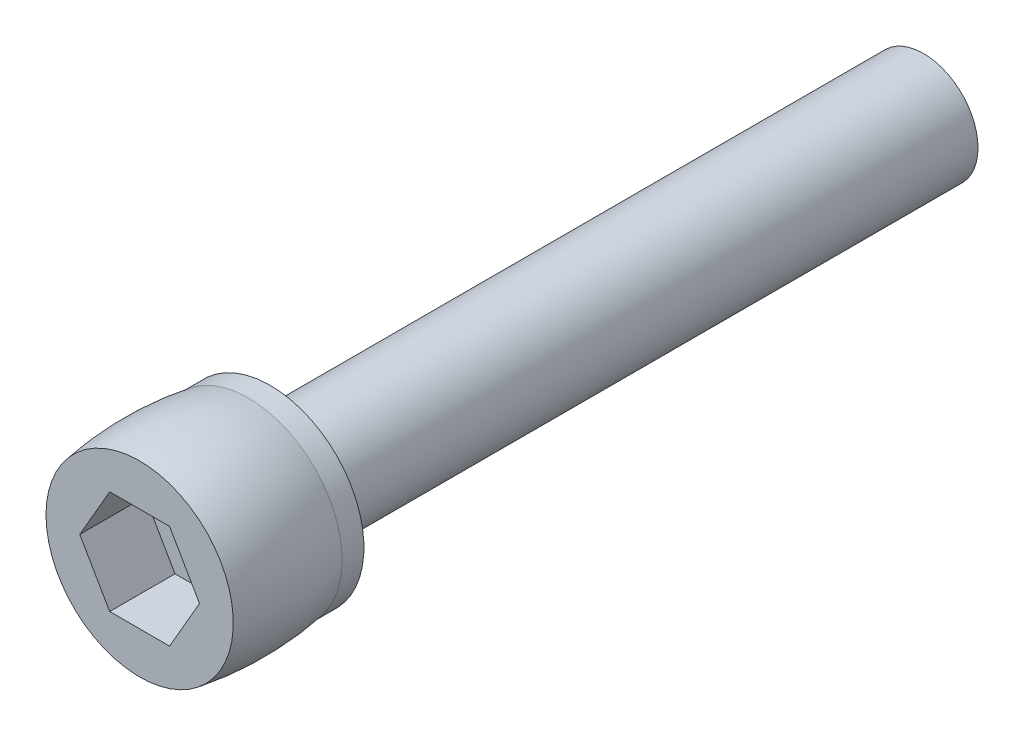
ISO-10303-21;
HEADER;
FILE_DESCRIPTION(('STEP AP214'),'2;1');
FILE_NAME('part.step','',(''),(''),'','','');
FILE_SCHEMA(('AUTOMOTIVE_DESIGN { 1 0 10303 214 1 1 1 1 }'));
ENDSEC;
DATA;
#1=APPLICATION_CONTEXT('core data for automotive mechanical design processes');
#2=APPLICATION_PROTOCOL_DEFINITION('international standard','automotive_design',2000,#1);
#3=PRODUCT_CONTEXT('',#1,'mechanical');
#4=PRODUCT('Part','Part','',(#3));
#5=PRODUCT_RELATED_PRODUCT_CATEGORY('part','',(#4));
#6=PRODUCT_DEFINITION_FORMATION('','',#4);
#7=PRODUCT_DEFINITION_CONTEXT('part definition',#1,'design');
#8=PRODUCT_DEFINITION('design','',#6,#7);
#9=PRODUCT_DEFINITION_SHAPE('','',#8);
#10=(LENGTH_UNIT() NAMED_UNIT(*) SI_UNIT(.MILLI.,.METRE.));
#11=(NAMED_UNIT(*) PLANE_ANGLE_UNIT() SI_UNIT($,.RADIAN.));
#12=(NAMED_UNIT(*) SI_UNIT($,.STERADIAN.) SOLID_ANGLE_UNIT());
#13=UNCERTAINTY_MEASURE_WITH_UNIT(LENGTH_MEASURE(1.E-05),#10,'distance_accuracy_value','');
#14=(GEOMETRIC_REPRESENTATION_CONTEXT(3) GLOBAL_UNCERTAINTY_ASSIGNED_CONTEXT((#13)) GLOBAL_UNIT_ASSIGNED_CONTEXT((#10,
#11,#12)) REPRESENTATION_CONTEXT('',''));
#15=CARTESIAN_POINT('',(0.,0.,0.));
#16=DIRECTION('',(0.,0.,1.));
#17=DIRECTION('',(1.,0.,0.));
#18=AXIS2_PLACEMENT_3D('',#15,#16,#17);
#19=CARTESIAN_POINT('',(0.,0.,0.));
#20=DIRECTION('',(0.,0.,1.));
#21=DIRECTION('',(1.,0.,0.));
#22=AXIS2_PLACEMENT_3D('',#19,#20,#21);
#23=PLANE('',#22);
#24=CARTESIAN_POINT('',(0.,0.,0.));
#25=DIRECTION('',(0.,0.,1.));
#26=DIRECTION('',(1.,0.,0.));
#27=AXIS2_PLACEMENT_3D('',#24,#25,#26);
#28=CIRCLE('',#27,1.25);
#29=CARTESIAN_POINT('',(1.25,0.,0.));
#30=VERTEX_POINT('',#29);
#31=EDGE_CURVE('E45',#30,#30,#28,.T.);
#32=ORIENTED_EDGE('',*,*,#31,.T.);
#33=EDGE_LOOP('',(#32));
#34=FACE_BOUND('',#33,.T.);
#35=CARTESIAN_POINT('',(0.,0.,0.));
#36=DIRECTION('',(0.,0.,-1.));
#37=DIRECTION('',(-1.,0.,0.));
#38=AXIS2_PLACEMENT_3D('',#35,#36,#37);
#39=CIRCLE('',#38,2.15);
#40=CARTESIAN_POINT('',(-2.15,0.,0.));
#41=VERTEX_POINT('',#40);
#42=EDGE_CURVE('E169',#41,#41,#39,.T.);
#43=ORIENTED_EDGE('',*,*,#42,.T.);
#44=EDGE_LOOP('',(#43));
#45=FACE_BOUND('',#44,.T.);
#46=ADVANCED_FACE('F41',(#34,#45),#23,.F.);
#47=CARTESIAN_POINT('',(0.,0.,-15.));
#48=DIRECTION('',(0.,0.,1.));
#49=DIRECTION('',(1.,0.,0.));
#50=AXIS2_PLACEMENT_3D('',#47,#48,#49);
#51=CYLINDRICAL_SURFACE('',#50,1.25);
#52=CARTESIAN_POINT('',(0.,0.,-15.));
#53=DIRECTION('',(0.,0.,1.));
#54=DIRECTION('',(1.,0.,0.));
#55=AXIS2_PLACEMENT_3D('',#52,#53,#54);
#56=CIRCLE('',#55,1.25);
#57=CARTESIAN_POINT('',(1.25,0.,-15.));
#58=VERTEX_POINT('',#57);
#59=EDGE_CURVE('E11',#58,#58,#56,.T.);
#60=ORIENTED_EDGE('',*,*,#59,.T.);
#61=EDGE_LOOP('',(#60));
#62=FACE_BOUND('',#61,.T.);
#63=ORIENTED_EDGE('',*,*,#31,.F.);
#64=EDGE_LOOP('',(#63));
#65=FACE_BOUND('',#64,.T.);
#66=ADVANCED_FACE('F43',(#62,#65),#51,.T.);
#67=CARTESIAN_POINT('',(0.,0.,-15.));
#68=DIRECTION('',(0.,0.,1.));
#69=DIRECTION('',(1.,0.,0.));
#70=AXIS2_PLACEMENT_3D('',#67,#68,#69);
#71=PLANE('',#70);
#72=ORIENTED_EDGE('',*,*,#59,.F.);
#73=EDGE_LOOP('',(#72));
#74=FACE_BOUND('',#73,.T.);
#75=ADVANCED_FACE('F185',(#74),#71,.F.);
#76=CARTESIAN_POINT('',(0.,0.,1.75));
#77=DIRECTION('',(0.,0.,-1.));
#78=DIRECTION('',(-1.,0.,0.));
#79=AXIS2_PLACEMENT_3D('',#76,#77,#78);
#80=DEGENERATE_TOROIDAL_SURFACE('',#79,5.61250000000011,7.86250000000011,.F.);
#81=CARTESIAN_POINT('',(0.,0.,3.));
#82=DIRECTION('',(0.,0.,-1.));
#83=DIRECTION('',(-1.,0.,0.));
#84=AXIS2_PLACEMENT_3D('',#81,#82,#83);
#85=CIRCLE('',#84,2.15);
#86=CARTESIAN_POINT('',(-2.15,0.,3.));
#87=VERTEX_POINT('',#86);
#88=EDGE_CURVE('E156',#87,#87,#85,.T.);
#89=ORIENTED_EDGE('',*,*,#88,.T.);
#90=EDGE_LOOP('',(#89));
#91=FACE_BOUND('',#90,.T.);
#92=CARTESIAN_POINT('',(0.,0.,0.5));
#93=DIRECTION('',(0.,0.,-1.));
#94=DIRECTION('',(-1.,0.,0.));
#95=AXIS2_PLACEMENT_3D('',#92,#93,#94);
#96=CIRCLE('',#95,2.15);
#97=CARTESIAN_POINT('',(-2.15,0.,0.5));
#98=VERTEX_POINT('',#97);
#99=EDGE_CURVE('E173',#98,#98,#96,.T.);
#100=ORIENTED_EDGE('',*,*,#99,.F.);
#101=EDGE_LOOP('',(#100));
#102=FACE_BOUND('',#101,.T.);
#103=ADVANCED_FACE('F191',(#91,#102),#80,.F.);
#104=CARTESIAN_POINT('',(0.,0.,3.));
#105=DIRECTION('',(0.,0.,-1.));
#106=DIRECTION('',(-1.,0.,0.));
#107=AXIS2_PLACEMENT_3D('',#104,#105,#106);
#108=CYLINDRICAL_SURFACE('',#107,2.15);
#109=ORIENTED_EDGE('',*,*,#42,.F.);
#110=EDGE_LOOP('',(#109));
#111=FACE_BOUND('',#110,.T.);
#112=ORIENTED_EDGE('',*,*,#99,.T.);
#113=EDGE_LOOP('',(#112));
#114=FACE_BOUND('',#113,.T.);
#115=ADVANCED_FACE('F202',(#111,#114),#108,.T.);
#116=CARTESIAN_POINT('',(0.,0.,3.));
#117=DIRECTION('',(0.,0.,1.));
#118=DIRECTION('',(1.,0.,0.));
#119=AXIS2_PLACEMENT_3D('',#116,#117,#118);
#120=PLANE('',#119);
#121=DIRECTION('',(0.5,0.866025403784439,0.));
#122=VECTOR('',#121,1.);
#123=CARTESIAN_POINT('',(0.687407664253899,-1.190625,3.));
#124=LINE('',#123,#122);
#125=CARTESIAN_POINT('',(0.687407664253899,-1.190625,3.));
#126=VERTEX_POINT('',#125);
#127=CARTESIAN_POINT('',(1.3748153285078,0.,3.));
#128=VERTEX_POINT('',#127);
#129=EDGE_CURVE('E57',#126,#128,#124,.T.);
#130=ORIENTED_EDGE('',*,*,#129,.F.);
#131=DIRECTION('',(1.,0.,0.));
#132=VECTOR('',#131,1.);
#133=CARTESIAN_POINT('',(-0.687407664253898,-1.190625,3.));
#134=LINE('',#133,#132);
#135=CARTESIAN_POINT('',(-0.687407664253898,-1.190625,3.));
#136=VERTEX_POINT('',#135);
#137=EDGE_CURVE('E150',#136,#126,#134,.T.);
#138=ORIENTED_EDGE('',*,*,#137,.F.);
#139=DIRECTION('',(0.5,-0.866025403784439,0.));
#140=VECTOR('',#139,1.);
#141=CARTESIAN_POINT('',(-1.3748153285078,0.,3.));
#142=LINE('',#141,#140);
#143=CARTESIAN_POINT('',(-1.3748153285078,0.,3.));
#144=VERTEX_POINT('',#143);
#145=EDGE_CURVE('E147',#144,#136,#142,.T.);
#146=ORIENTED_EDGE('',*,*,#145,.F.);
#147=DIRECTION('',(-0.5,-0.866025403784439,0.));
#148=VECTOR('',#147,1.);
#149=CARTESIAN_POINT('',(-0.687407664253899,1.190625,3.));
#150=LINE('',#149,#148);
#151=CARTESIAN_POINT('',(-0.687407664253899,1.190625,3.));
#152=VERTEX_POINT('',#151);
#153=EDGE_CURVE('E105',#152,#144,#150,.T.);
#154=ORIENTED_EDGE('',*,*,#153,.F.);
#155=DIRECTION('',(-1.,0.,0.));
#156=VECTOR('',#155,1.);
#157=CARTESIAN_POINT('',(0.687407664253899,1.190625,3.));
#158=LINE('',#157,#156);
#159=CARTESIAN_POINT('',(0.687407664253899,1.190625,3.));
#160=VERTEX_POINT('',#159);
#161=EDGE_CURVE('E141',#160,#152,#158,.T.);
#162=ORIENTED_EDGE('',*,*,#161,.F.);
#163=DIRECTION('',(-0.5,0.866025403784439,0.));
#164=VECTOR('',#163,1.);
#165=CARTESIAN_POINT('',(1.3748153285078,0.,3.));
#166=LINE('',#165,#164);
#167=EDGE_CURVE('E137',#128,#160,#166,.T.);
#168=ORIENTED_EDGE('',*,*,#167,.F.);
#169=EDGE_LOOP('',(#130,#138,#146,#154,#162,#168));
#170=FACE_BOUND('',#169,.T.);
#171=ORIENTED_EDGE('',*,*,#88,.F.);
#172=EDGE_LOOP('',(#171));
#173=FACE_BOUND('',#172,.T.);
#174=ADVANCED_FACE('F198',(#170,#173),#120,.T.);
#175=CARTESIAN_POINT('',(0.687407664253899,-1.190625,1.5));
#176=DIRECTION('',(0.866025403784439,-0.5,0.));
#177=DIRECTION('',(0.5,0.866025403784439,0.));
#178=AXIS2_PLACEMENT_3D('',#175,#176,#177);
#179=PLANE('',#178);
#180=ORIENTED_EDGE('',*,*,#129,.T.);
#181=DIRECTION('',(0.,0.,1.));
#182=VECTOR('',#181,1.);
#183=CARTESIAN_POINT('',(1.3748153285078,0.,1.5));
#184=LINE('',#183,#182);
#185=CARTESIAN_POINT('',(1.3748153285078,0.,1.5));
#186=VERTEX_POINT('',#185);
#187=EDGE_CURVE('E87',#186,#128,#184,.T.);
#188=ORIENTED_EDGE('',*,*,#187,.F.);
#189=DIRECTION('',(0.5,0.866025403784439,0.));
#190=VECTOR('',#189,1.);
#191=CARTESIAN_POINT('',(0.687407664253899,-1.190625,1.5));
#192=LINE('',#191,#190);
#193=CARTESIAN_POINT('',(0.687407664253899,-1.190625,1.5));
#194=VERTEX_POINT('',#193);
#195=EDGE_CURVE('E153',#194,#186,#192,.T.);
#196=ORIENTED_EDGE('',*,*,#195,.F.);
#197=DIRECTION('',(0.,0.,1.));
#198=VECTOR('',#197,1.);
#199=CARTESIAN_POINT('',(0.687407664253899,-1.190625,1.5));
#200=LINE('',#199,#198);
#201=EDGE_CURVE('E65',#194,#126,#200,.T.);
#202=ORIENTED_EDGE('',*,*,#201,.T.);
#203=EDGE_LOOP('',(#180,#188,#196,#202));
#204=FACE_BOUND('',#203,.T.);
#205=ADVANCED_FACE('F201',(#204),#179,.F.);
#206=CARTESIAN_POINT('',(-0.687407664253898,-1.190625,1.5));
#207=DIRECTION('',(0.,-1.,0.));
#208=DIRECTION('',(0.,0.,-1.));
#209=AXIS2_PLACEMENT_3D('',#206,#207,#208);
#210=PLANE('',#209);
#211=ORIENTED_EDGE('',*,*,#137,.T.);
#212=ORIENTED_EDGE('',*,*,#201,.F.);
#213=DIRECTION('',(1.,0.,0.));
#214=VECTOR('',#213,1.);
#215=CARTESIAN_POINT('',(-0.687407664253898,-1.190625,1.5));
#216=LINE('',#215,#214);
#217=CARTESIAN_POINT('',(-0.687407664253898,-1.190625,1.5));
#218=VERTEX_POINT('',#217);
#219=EDGE_CURVE('E119',#218,#194,#216,.T.);
#220=ORIENTED_EDGE('',*,*,#219,.F.);
#221=DIRECTION('',(0.,0.,1.));
#222=VECTOR('',#221,1.);
#223=CARTESIAN_POINT('',(-0.687407664253898,-1.190625,1.5));
#224=LINE('',#223,#222);
#225=EDGE_CURVE('E110',#218,#136,#224,.T.);
#226=ORIENTED_EDGE('',*,*,#225,.T.);
#227=EDGE_LOOP('',(#211,#212,#220,#226));
#228=FACE_BOUND('',#227,.T.);
#229=ADVANCED_FACE('F212',(#228),#210,.F.);
#230=CARTESIAN_POINT('',(-1.3748153285078,0.,1.5));
#231=DIRECTION('',(-0.866025403784439,-0.5,0.));
#232=DIRECTION('',(0.5,-0.866025403784439,0.));
#233=AXIS2_PLACEMENT_3D('',#230,#231,#232);
#234=PLANE('',#233);
#235=ORIENTED_EDGE('',*,*,#145,.T.);
#236=ORIENTED_EDGE('',*,*,#225,.F.);
#237=DIRECTION('',(0.5,-0.866025403784439,0.));
#238=VECTOR('',#237,1.);
#239=CARTESIAN_POINT('',(-1.3748153285078,0.,1.5));
#240=LINE('',#239,#238);
#241=CARTESIAN_POINT('',(-1.3748153285078,0.,1.5));
#242=VERTEX_POINT('',#241);
#243=EDGE_CURVE('E114',#242,#218,#240,.T.);
#244=ORIENTED_EDGE('',*,*,#243,.F.);
#245=DIRECTION('',(0.,0.,1.));
#246=VECTOR('',#245,1.);
#247=CARTESIAN_POINT('',(-1.3748153285078,0.,1.5));
#248=LINE('',#247,#246);
#249=EDGE_CURVE('E98',#242,#144,#248,.T.);
#250=ORIENTED_EDGE('',*,*,#249,.T.);
#251=EDGE_LOOP('',(#235,#236,#244,#250));
#252=FACE_BOUND('',#251,.T.);
#253=ADVANCED_FACE('F115',(#252),#234,.F.);
#254=CARTESIAN_POINT('',(-0.687407664253899,1.190625,1.5));
#255=DIRECTION('',(-0.866025403784439,0.5,0.));
#256=DIRECTION('',(-0.5,-0.866025403784439,0.));
#257=AXIS2_PLACEMENT_3D('',#254,#255,#256);
#258=PLANE('',#257);
#259=ORIENTED_EDGE('',*,*,#153,.T.);
#260=ORIENTED_EDGE('',*,*,#249,.F.);
#261=DIRECTION('',(-0.5,-0.866025403784439,0.));
#262=VECTOR('',#261,1.);
#263=CARTESIAN_POINT('',(-0.687407664253899,1.190625,1.5));
#264=LINE('',#263,#262);
#265=CARTESIAN_POINT('',(-0.687407664253899,1.190625,1.5));
#266=VERTEX_POINT('',#265);
#267=EDGE_CURVE('E102',#266,#242,#264,.T.);
#268=ORIENTED_EDGE('',*,*,#267,.F.);
#269=DIRECTION('',(0.,0.,1.));
#270=VECTOR('',#269,1.);
#271=CARTESIAN_POINT('',(-0.687407664253899,1.190625,1.5));
#272=LINE('',#271,#270);
#273=EDGE_CURVE('E111',#266,#152,#272,.T.);
#274=ORIENTED_EDGE('',*,*,#273,.T.);
#275=EDGE_LOOP('',(#259,#260,#268,#274));
#276=FACE_BOUND('',#275,.T.);
#277=ADVANCED_FACE('F100',(#276),#258,.F.);
#278=CARTESIAN_POINT('',(0.687407664253899,1.190625,1.5));
#279=DIRECTION('',(0.,1.,0.));
#280=DIRECTION('',(-1.,0.,0.));
#281=AXIS2_PLACEMENT_3D('',#278,#279,#280);
#282=PLANE('',#281);
#283=ORIENTED_EDGE('',*,*,#161,.T.);
#284=ORIENTED_EDGE('',*,*,#273,.F.);
#285=DIRECTION('',(-1.,0.,0.));
#286=VECTOR('',#285,1.);
#287=CARTESIAN_POINT('',(0.687407664253899,1.190625,1.5));
#288=LINE('',#287,#286);
#289=CARTESIAN_POINT('',(0.687407664253899,1.190625,1.5));
#290=VERTEX_POINT('',#289);
#291=EDGE_CURVE('E125',#290,#266,#288,.T.);
#292=ORIENTED_EDGE('',*,*,#291,.F.);
#293=DIRECTION('',(0.,0.,1.));
#294=VECTOR('',#293,1.);
#295=CARTESIAN_POINT('',(0.687407664253899,1.190625,1.5));
#296=LINE('',#295,#294);
#297=EDGE_CURVE('E161',#290,#160,#296,.T.);
#298=ORIENTED_EDGE('',*,*,#297,.T.);
#299=EDGE_LOOP('',(#283,#284,#292,#298));
#300=FACE_BOUND('',#299,.T.);
#301=ADVANCED_FACE('F216',(#300),#282,.F.);
#302=CARTESIAN_POINT('',(1.3748153285078,0.,1.5));
#303=DIRECTION('',(0.866025403784438,0.5,0.));
#304=DIRECTION('',(-0.5,0.866025403784439,0.));
#305=AXIS2_PLACEMENT_3D('',#302,#303,#304);
#306=PLANE('',#305);
#307=ORIENTED_EDGE('',*,*,#167,.T.);
#308=ORIENTED_EDGE('',*,*,#297,.F.);
#309=DIRECTION('',(-0.5,0.866025403784439,0.));
#310=VECTOR('',#309,1.);
#311=CARTESIAN_POINT('',(1.3748153285078,0.,1.5));
#312=LINE('',#311,#310);
#313=EDGE_CURVE('E129',#186,#290,#312,.T.);
#314=ORIENTED_EDGE('',*,*,#313,.F.);
#315=ORIENTED_EDGE('',*,*,#187,.T.);
#316=EDGE_LOOP('',(#307,#308,#314,#315));
#317=FACE_BOUND('',#316,.T.);
#318=ADVANCED_FACE('F213',(#317),#306,.F.);
#319=CARTESIAN_POINT('',(0.,0.,1.5));
#320=DIRECTION('',(0.,0.,1.));
#321=DIRECTION('',(1.,0.,0.));
#322=AXIS2_PLACEMENT_3D('',#319,#320,#321);
#323=PLANE('',#322);
#324=ORIENTED_EDGE('',*,*,#195,.T.);
#325=ORIENTED_EDGE('',*,*,#313,.T.);
#326=ORIENTED_EDGE('',*,*,#291,.T.);
#327=ORIENTED_EDGE('',*,*,#267,.T.);
#328=ORIENTED_EDGE('',*,*,#243,.T.);
#329=ORIENTED_EDGE('',*,*,#219,.T.);
#330=EDGE_LOOP('',(#324,#325,#326,#327,#328,#329));
#331=FACE_BOUND('',#330,.T.);
#332=ADVANCED_FACE('F122',(#331),#323,.T.);
#333=CLOSED_SHELL('',(#46,#66,#75,#103,#115,#174,#205,#229,#253,#277,#301,#318,#332));
#334=MANIFOLD_SOLID_BREP('B2',#333);
#335=ADVANCED_BREP_SHAPE_REPRESENTATION('',(#18,#334),#14);
#336=SHAPE_DEFINITION_REPRESENTATION(#9,#335);
ENDSEC;
END-ISO-10303-21;
